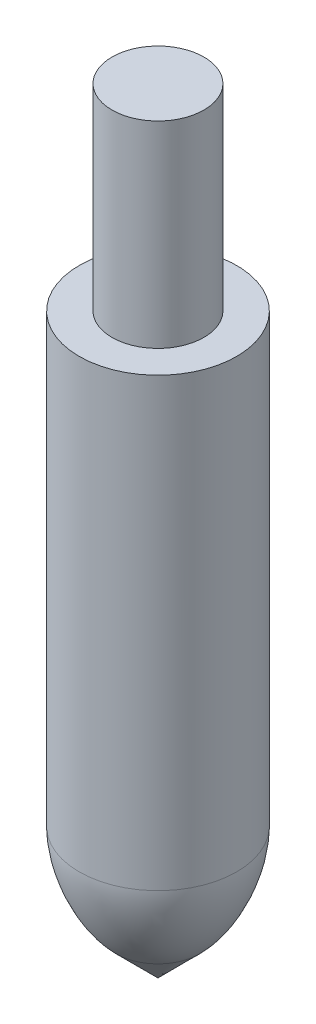
ISO-10303-21;
HEADER;
FILE_DESCRIPTION(('STEP AP214'),'2;1');
FILE_NAME('part.step','',(''),(''),'','','');
FILE_SCHEMA(('AUTOMOTIVE_DESIGN { 1 0 10303 214 1 1 1 1 }'));
ENDSEC;
DATA;
#1=APPLICATION_CONTEXT('core data for automotive mechanical design processes');
#2=APPLICATION_PROTOCOL_DEFINITION('international standard','automotive_design',2000,#1);
#3=PRODUCT_CONTEXT('',#1,'mechanical');
#4=PRODUCT('Part','Part','',(#3));
#5=PRODUCT_RELATED_PRODUCT_CATEGORY('part','',(#4));
#6=PRODUCT_DEFINITION_FORMATION('','',#4);
#7=PRODUCT_DEFINITION_CONTEXT('part definition',#1,'design');
#8=PRODUCT_DEFINITION('design','',#6,#7);
#9=PRODUCT_DEFINITION_SHAPE('','',#8);
#10=(LENGTH_UNIT() NAMED_UNIT(*) SI_UNIT(.MILLI.,.METRE.));
#11=(NAMED_UNIT(*) PLANE_ANGLE_UNIT() SI_UNIT($,.RADIAN.));
#12=(NAMED_UNIT(*) SI_UNIT($,.STERADIAN.) SOLID_ANGLE_UNIT());
#13=UNCERTAINTY_MEASURE_WITH_UNIT(LENGTH_MEASURE(1.E-05),#10,'distance_accuracy_value','');
#14=(GEOMETRIC_REPRESENTATION_CONTEXT(3) GLOBAL_UNCERTAINTY_ASSIGNED_CONTEXT((#13)) GLOBAL_UNIT_ASSIGNED_CONTEXT((#10,
#11,#12)) REPRESENTATION_CONTEXT('',''));
#15=CARTESIAN_POINT('',(0.,0.,0.));
#16=DIRECTION('',(0.,0.,1.));
#17=DIRECTION('',(1.,0.,0.));
#18=AXIS2_PLACEMENT_3D('',#15,#16,#17);
#19=CARTESIAN_POINT('',(0.,40.5915203347771,0.));
#20=DIRECTION('',(0.,1.,0.));
#21=DIRECTION('',(0.,0.,1.));
#22=AXIS2_PLACEMENT_3D('',#19,#20,#21);
#23=CYLINDRICAL_SURFACE('',#22,3.);
#24=CARTESIAN_POINT('',(0.,22.,0.));
#25=DIRECTION('',(0.,1.,0.));
#26=DIRECTION('',(0.,0.,1.));
#27=AXIS2_PLACEMENT_3D('',#24,#25,#26);
#28=CIRCLE('',#27,3.);
#29=CARTESIAN_POINT('',(0.,22.,3.));
#30=VERTEX_POINT('',#29);
#31=EDGE_CURVE('E86',#30,#30,#28,.T.);
#32=ORIENTED_EDGE('',*,*,#31,.F.);
#33=EDGE_LOOP('',(#32));
#34=FACE_BOUND('',#33,.T.);
#35=CARTESIAN_POINT('',(0.,5.00000000000002,0.));
#36=DIRECTION('',(0.,-1.,0.));
#37=DIRECTION('',(1.,0.,0.));
#38=AXIS2_PLACEMENT_3D('',#35,#36,#37);
#39=CIRCLE('',#38,3.00000000000002);
#40=CARTESIAN_POINT('',(3.,5.00000000000003,0.));
#41=VERTEX_POINT('',#40);
#42=EDGE_CURVE('E95',#41,#41,#39,.T.);
#43=ORIENTED_EDGE('',*,*,#42,.F.);
#44=EDGE_LOOP('',(#43));
#45=FACE_BOUND('',#44,.T.);
#46=ADVANCED_FACE('F40',(#34,#45),#23,.T.);
#47=CARTESIAN_POINT('',(0.,29.5,0.));
#48=DIRECTION('',(0.,-1.,0.));
#49=DIRECTION('',(0.,0.,-1.));
#50=AXIS2_PLACEMENT_3D('',#47,#48,#49);
#51=PLANE('',#50);
#52=CARTESIAN_POINT('',(0.,29.5,0.));
#53=DIRECTION('',(0.,1.,0.));
#54=DIRECTION('',(0.,0.,1.));
#55=AXIS2_PLACEMENT_3D('',#52,#53,#54);
#56=CIRCLE('',#55,1.75);
#57=CARTESIAN_POINT('',(0.,29.5,1.75));
#58=VERTEX_POINT('',#57);
#59=EDGE_CURVE('E11',#58,#58,#56,.T.);
#60=ORIENTED_EDGE('',*,*,#59,.T.);
#61=EDGE_LOOP('',(#60));
#62=FACE_BOUND('',#61,.T.);
#63=ADVANCED_FACE('F62',(#62),#51,.F.);
#64=CARTESIAN_POINT('',(0.,40.5915203347771,0.));
#65=DIRECTION('',(0.,1.,0.));
#66=DIRECTION('',(0.,0.,1.));
#67=AXIS2_PLACEMENT_3D('',#64,#65,#66);
#68=CYLINDRICAL_SURFACE('',#67,1.75);
#69=ORIENTED_EDGE('',*,*,#59,.F.);
#70=EDGE_LOOP('',(#69));
#71=FACE_BOUND('',#70,.T.);
#72=CARTESIAN_POINT('',(0.,22.,0.));
#73=DIRECTION('',(0.,1.,0.));
#74=DIRECTION('',(0.,0.,1.));
#75=AXIS2_PLACEMENT_3D('',#72,#73,#74);
#76=CIRCLE('',#75,1.75);
#77=CARTESIAN_POINT('',(0.,22.,1.75));
#78=VERTEX_POINT('',#77);
#79=EDGE_CURVE('E48',#78,#78,#76,.T.);
#80=ORIENTED_EDGE('',*,*,#79,.T.);
#81=EDGE_LOOP('',(#80));
#82=FACE_BOUND('',#81,.T.);
#83=ADVANCED_FACE('F68',(#71,#82),#68,.T.);
#84=CARTESIAN_POINT('',(1.75,22.,0.));
#85=DIRECTION('',(0.,-1.,0.));
#86=DIRECTION('',(0.,0.,-1.));
#87=AXIS2_PLACEMENT_3D('',#84,#85,#86);
#88=PLANE('',#87);
#89=ORIENTED_EDGE('',*,*,#79,.F.);
#90=EDGE_LOOP('',(#89));
#91=FACE_BOUND('',#90,.T.);
#92=ORIENTED_EDGE('',*,*,#31,.T.);
#93=EDGE_LOOP('',(#92));
#94=FACE_BOUND('',#93,.T.);
#95=ADVANCED_FACE('F57',(#91,#94),#88,.F.);
#96=CARTESIAN_POINT('',(3.,5.,0.));
#97=CARTESIAN_POINT('',(3.,3.89421295878914,0.));
#98=CARTESIAN_POINT('',(2.406543361052,2.406543361052,0.));
#99=CARTESIAN_POINT('',(1.58578643762685,1.58578643762685,0.));
#100=B_SPLINE_CURVE_WITH_KNOTS('',3,(#96,#97,#98,#99),.UNSPECIFIED.,.F.,.F.,(4,4),(0.,1.),.UNSPECIFIED.);
#101=CARTESIAN_POINT('',(0.,0.,0.));
#102=DIRECTION('',(0.,-1.,0.));
#103=AXIS1_PLACEMENT('',#101,#102);
#104=SURFACE_OF_REVOLUTION('',#100,#103);
#105=CARTESIAN_POINT('',(0.,1.58578643762685,0.));
#106=DIRECTION('',(0.,-1.,0.));
#107=DIRECTION('',(1.,0.,0.));
#108=AXIS2_PLACEMENT_3D('',#105,#106,#107);
#109=CIRCLE('',#108,1.58578643762686);
#110=CARTESIAN_POINT('',(1.58578643762685,1.58578643762685,0.));
#111=VERTEX_POINT('',#110);
#112=EDGE_CURVE('E90',#111,#111,#109,.T.);
#113=ORIENTED_EDGE('',*,*,#112,.F.);
#114=EDGE_LOOP('',(#113));
#115=FACE_BOUND('',#114,.T.);
#116=ORIENTED_EDGE('',*,*,#42,.T.);
#117=EDGE_LOOP('',(#116));
#118=FACE_BOUND('',#117,.T.);
#119=ADVANCED_FACE('F52',(#115,#118),#104,.T.);
#120=CARTESIAN_POINT('',(0.,0.,0.));
#121=DIRECTION('',(0.,1.,0.));
#122=DIRECTION('',(0.,0.,1.));
#123=AXIS2_PLACEMENT_3D('',#120,#121,#122);
#124=CONICAL_SURFACE('',#123,0.,0.785398163397442);
#125=ORIENTED_EDGE('',*,*,#112,.T.);
#126=EDGE_LOOP('',(#125));
#127=FACE_BOUND('',#126,.T.);
#128=CARTESIAN_POINT('',(0.,0.,0.));
#129=VERTEX_POINT('',#128);
#130=VERTEX_LOOP('',#129);
#131=FACE_BOUND('',#130,.T.);
#132=ADVANCED_FACE('F42',(#127,#131),#124,.T.);
#133=CLOSED_SHELL('',(#46,#63,#83,#95,#119,#132));
#134=MANIFOLD_SOLID_BREP('B2',#133);
#135=ADVANCED_BREP_SHAPE_REPRESENTATION('',(#18,#134),#14);
#136=SHAPE_DEFINITION_REPRESENTATION(#9,#135);
ENDSEC;
END-ISO-10303-21;
